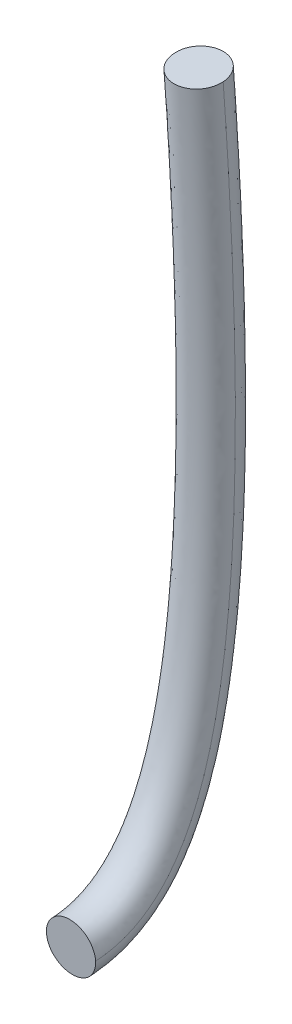
ISO-10303-21;
HEADER;
FILE_DESCRIPTION(('STEP AP214'),'2;1');
FILE_NAME('part.step','',(''),(''),'','','');
FILE_SCHEMA(('AUTOMOTIVE_DESIGN { 1 0 10303 214 1 1 1 1 }'));
ENDSEC;
DATA;
#1=APPLICATION_CONTEXT('core data for automotive mechanical design processes');
#2=APPLICATION_PROTOCOL_DEFINITION('international standard','automotive_design',2000,#1);
#3=PRODUCT_CONTEXT('',#1,'mechanical');
#4=PRODUCT('Part','Part','',(#3));
#5=PRODUCT_RELATED_PRODUCT_CATEGORY('part','',(#4));
#6=PRODUCT_DEFINITION_FORMATION('','',#4);
#7=PRODUCT_DEFINITION_CONTEXT('part definition',#1,'design');
#8=PRODUCT_DEFINITION('design','',#6,#7);
#9=PRODUCT_DEFINITION_SHAPE('','',#8);
#10=(LENGTH_UNIT() NAMED_UNIT(*) SI_UNIT(.MILLI.,.METRE.));
#11=(NAMED_UNIT(*) PLANE_ANGLE_UNIT() SI_UNIT($,.RADIAN.));
#12=(NAMED_UNIT(*) SI_UNIT($,.STERADIAN.) SOLID_ANGLE_UNIT());
#13=UNCERTAINTY_MEASURE_WITH_UNIT(LENGTH_MEASURE(1.E-05),#10,'distance_accuracy_value','');
#14=(GEOMETRIC_REPRESENTATION_CONTEXT(3) GLOBAL_UNCERTAINTY_ASSIGNED_CONTEXT((#13)) GLOBAL_UNIT_ASSIGNED_CONTEXT((#10,
#11,#12)) REPRESENTATION_CONTEXT('',''));
#15=CARTESIAN_POINT('',(0.,0.,0.));
#16=DIRECTION('',(0.,0.,1.));
#17=DIRECTION('',(1.,0.,0.));
#18=AXIS2_PLACEMENT_3D('',#15,#16,#17);
#19=CARTESIAN_POINT('',(9.115,-7.38568943191456,11.1672900449514));
#20=CARTESIAN_POINT('',(9.11499999999981,-7.37642950308164,10.9994364502612));
#21=CARTESIAN_POINT('',(9.1149999999996,-7.27630161286562,10.6948057955698));
#22=CARTESIAN_POINT('',(9.11499999999973,-6.87048720732761,10.3352015018694));
#23=CARTESIAN_POINT('',(9.11500000000011,-6.18721226743467,10.0812548456688));
#24=CARTESIAN_POINT('',(9.11500000000063,-5.0663778437877,9.90824199229226));
#25=CARTESIAN_POINT('',(9.11500000000089,-3.38097481614013,9.86452831959879));
#26=CARTESIAN_POINT('',(9.11500000000045,-1.83527381521949,9.93899557759439));
#27=CARTESIAN_POINT('',(9.115,-1.00000001490137,10.0000001490162));
#28=CARTESIAN_POINT('',(9.11500000000102,-7.43610265920569,11.1645089135862));
#29=CARTESIAN_POINT('',(9.11500000000083,-7.42638032085317,10.9882732782254));
#30=CARTESIAN_POINT('',(9.11500000000062,-7.31962473383052,10.6638759934467));
#31=CARTESIAN_POINT('',(9.11500000000075,-6.89389539217406,10.2892055228043));
#32=CARTESIAN_POINT('',(9.11500000000113,-6.19822133407688,10.0317252218436));
#33=CARTESIAN_POINT('',(9.11500000000165,-5.06946229004234,9.85764906158687));
#34=CARTESIAN_POINT('',(9.11500000000191,-3.37988701446978,9.81403625051808));
#35=CARTESIAN_POINT('',(9.11500000000147,-1.83238214013708,9.88858240859414));
#36=CARTESIAN_POINT('',(9.11500000000102,-0.996322261093758,9.94964439160444));
#37=CARTESIAN_POINT('',(9.09146786962668,-7.50310492328892,11.1608126198119));
#38=CARTESIAN_POINT('',(9.09146786962649,-7.49276846163421,10.9734448466436));
#39=CARTESIAN_POINT('',(9.09146786962628,-7.3771976458285,10.6227772349468));
#40=CARTESIAN_POINT('',(9.09146786962641,-6.92501159557868,10.2280915664686));
#41=CARTESIAN_POINT('',(9.09146786962679,-6.21285951910928,9.96590741199907));
#42=CARTESIAN_POINT('',(9.09146786962731,-5.07356734308345,9.79041474226226));
#43=CARTESIAN_POINT('',(9.09146786962757,-3.37844637103866,9.74693247719632));
#44=CARTESIAN_POINT('',(9.09146786962713,-1.82853816669608,9.82158027751201));
#45=CARTESIAN_POINT('',(9.09146786962668,-0.991434301225067,9.88271850850778));
#46=CARTESIAN_POINT('',(9.01948342635628,-7.57470631373006,11.1568626074155));
#47=CARTESIAN_POINT('',(9.0194834263561,-7.56371410597961,10.9576082051635));
#48=CARTESIAN_POINT('',(9.01948342635589,-7.43871511251737,10.5788679079541));
#49=CARTESIAN_POINT('',(9.01948342635602,-6.95826994744993,10.1628034777738));
#50=CARTESIAN_POINT('',(9.0194834263564,-6.22851016756536,9.89558376968682));
#51=CARTESIAN_POINT('',(9.01948342635692,-5.07796086887615,9.71857342657148));
#52=CARTESIAN_POINT('',(9.01948342635718,-3.37691291395785,9.67522650304673));
#53=CARTESIAN_POINT('',(9.01948342635674,-1.82442943423223,9.7499790951865));
#54=CARTESIAN_POINT('',(9.01948342635629,-0.986210825155924,9.81119874194781));
#55=CARTESIAN_POINT('',(8.92616546454589,-7.61993960906373,11.1543672358006));
#56=CARTESIAN_POINT('',(8.9261654645457,-7.6085323247427,10.9475887914416));
#57=CARTESIAN_POINT('',(8.9261654645455,-7.47758927953358,10.5511125803209));
#58=CARTESIAN_POINT('',(8.92616546454563,-6.9792708308918,10.1215265361115));
#59=CARTESIAN_POINT('',(8.926165464546,-6.23838546687176,9.85113924070783));
#60=CARTESIAN_POINT('',(8.92616546454652,-5.08072612978375,9.67317617231265));
#61=CARTESIAN_POINT('',(8.92616546454679,-3.37593483319648,9.62992115281699));
#62=CARTESIAN_POINT('',(8.92616546454635,-1.82183518214691,9.70474582988298));
#63=CARTESIAN_POINT('',(8.9261654645459,-0.982910958571682,9.76601701149439));
#64=CARTESIAN_POINT('',(8.78495011396524,-7.60399562018094,11.1552468130456));
#65=CARTESIAN_POINT('',(8.78495011396506,-7.59273481891444,10.9511236490569));
#66=CARTESIAN_POINT('',(8.78495011396485,-7.46388435940186,10.5608993423383));
#67=CARTESIAN_POINT('',(8.78495011396498,-6.97187044283369,10.1360828455063));
#68=CARTESIAN_POINT('',(8.78495011396535,-6.23490712162765,9.86680916057501));
#69=CARTESIAN_POINT('',(8.78495011396588,-5.07975363134254,9.68918061397055));
#70=CARTESIAN_POINT('',(8.78495011396614,-3.37628159541769,9.64589182494201));
#71=CARTESIAN_POINT('',(8.7849501139657,-1.82274931490772,9.72068982996092));
#72=CARTESIAN_POINT('',(8.78495011396525,-0.984074106994761,9.78194282460927));
#73=CARTESIAN_POINT('',(8.65809750279449,-7.47839072925796,11.16217602033));
#74=CARTESIAN_POINT('',(8.65809750279431,-7.46828109604625,10.9789199385373));
#75=CARTESIAN_POINT('',(8.6580975027941,-7.35595731599758,10.6379427983767));
#76=CARTESIAN_POINT('',(8.65809750279423,-6.91353780753687,10.2506457786371));
#77=CARTESIAN_POINT('',(8.65809750279461,-6.20746454637962,9.99019160163456));
#78=CARTESIAN_POINT('',(8.65809750279512,-5.07205701612371,9.81521916077235));
#79=CARTESIAN_POINT('',(8.65809750279539,-3.37898125058913,9.77168635012814));
#80=CARTESIAN_POINT('',(8.65809750279494,-1.82995552073657,9.84629446039183));
#81=CARTESIAN_POINT('',(8.65809750279449,-0.99323725505475,9.90740452894569));
#82=CARTESIAN_POINT('',(8.65800612197229,-7.34852671464861,11.1693401894111));
#83=CARTESIAN_POINT('',(8.65800612197211,-7.33960755615136,11.0076636968156));
#84=CARTESIAN_POINT('',(8.6580061219719,-7.24436683729051,10.7176040866006));
#85=CARTESIAN_POINT('',(8.65800612197203,-6.8532303937795,10.3691040594047));
#86=CARTESIAN_POINT('',(8.65800612197241,-6.1790953507803,10.1177639385277));
#87=CARTESIAN_POINT('',(8.65800612197292,-5.06410284199409,9.9455356576175));
#88=CARTESIAN_POINT('',(8.65800612197319,-3.38177555468385,9.90174842050027));
#89=CARTESIAN_POINT('',(8.65800612197274,-1.83740561899919,9.97615823942421));
#90=CARTESIAN_POINT('',(8.65800612197229,-1.00271111538596,10.0371205016688));
#91=CARTESIAN_POINT('',(8.68710455996887,-7.28816548469182,11.1726701192508));
#92=CARTESIAN_POINT('',(8.68710455996868,-7.2797995148274,11.0210212091821));
#93=CARTESIAN_POINT('',(8.68710455996847,-7.19250124903203,10.7546279948865));
#94=CARTESIAN_POINT('',(8.6871045599686,-6.82519755365371,10.4241580697461));
#95=CARTESIAN_POINT('',(8.68710455996898,-6.16590711497942,10.1770566494357));
#96=CARTESIAN_POINT('',(8.68710455996949,-5.06040385024568,10.0061049585468));
#97=CARTESIAN_POINT('',(8.68710455996976,-3.38307266499743,9.9622006231788));
#98=CARTESIAN_POINT('',(8.68710455996931,-1.84086870129545,10.0365193415074));
#99=CARTESIAN_POINT('',(8.68710455996886,-1.00711459747257,10.0974129212599));
#100=B_SPLINE_SURFACE_WITH_KNOTS('',3,3,((#19,#20,#21,#22,#23,#24,#25,#26,#27),(#28,#29,#30,#31,
#32,#33,#34,#35,#36),(#37,#38,#39,#40,#41,#42,#43,#44,#45),(#46,#47,#48,#49,#50,#51,#52,#53,
#54),(#55,#56,#57,#58,#59,#60,#61,#62,#63),(#64,#65,#66,#67,#68,#69,#70,#71,#72),(#73,#74,#75,
#76,#77,#78,#79,#80,#81),(#82,#83,#84,#85,#86,#87,#88,#89,#90),(#91,#92,#93,#94,#95,#96,#97,#98,
#99)),.UNSPECIFIED.,.F.,.F.,.F.,(4,1,1,1,1,1,4),(4,1,1,1,1,1,4),(-3.14159265358979,
-2.46839422782055,-2.24399475256414,-1.79519580205131,-1.12199737628207,-0.448798950512828,
0.448798950512828),(0.,0.142857142857143,0.285714285714286,0.428571428571429,0.571428571428571,
0.785714285714286,1.),.UNSPECIFIED.);
#101=CARTESIAN_POINT('',(9.115,-7.38568943191456,11.1672900449514));
#102=CARTESIAN_POINT('',(9.11499999999981,-7.37642950308164,10.9994364502612));
#103=CARTESIAN_POINT('',(9.1149999999996,-7.27630161286562,10.6948057955698));
#104=CARTESIAN_POINT('',(9.11499999999973,-6.87048720732761,10.3352015018694));
#105=CARTESIAN_POINT('',(9.11500000000011,-6.18721226743467,10.0812548456688));
#106=CARTESIAN_POINT('',(9.11500000000063,-5.0663778437877,9.90824199229226));
#107=CARTESIAN_POINT('',(9.11500000000089,-3.38097481614013,9.86452831959879));
#108=CARTESIAN_POINT('',(9.11500000000045,-1.83527381521949,9.93899557759439));
#109=CARTESIAN_POINT('',(9.115,-1.00000001490137,10.0000001490162));
#110=B_SPLINE_CURVE_WITH_KNOTS('',3,(#101,#102,#103,#104,#105,#106,#107,#108,#109),
.UNSPECIFIED.,.F.,.F.,(4,1,1,1,1,1,4),(0.,0.142857142857143,0.285714285714286,0.428571428571429,
0.571428571428571,0.785714285714286,1.),.UNSPECIFIED.);
#111=CARTESIAN_POINT('',(9.115,-7.38568943191456,11.1672900449514));
#112=VERTEX_POINT('',#111);
#113=CARTESIAN_POINT('',(9.115,-1.00000001490137,10.0000001490162));
#114=VERTEX_POINT('',#113);
#115=EDGE_CURVE('E11',#112,#114,#110,.T.);
#116=CARTESIAN_POINT('',(9.115,-7.38568943191456,11.1672900449514));
#117=CARTESIAN_POINT('',(9.11502150375269,-7.41102688804313,11.1658922611209));
#118=CARTESIAN_POINT('',(9.1105266851147,-7.43643690572857,11.1644904743087));
#119=CARTESIAN_POINT('',(9.09358015021283,-7.48438536470254,11.1618453160768));
#120=CARTESIAN_POINT('',(9.0811335997199,-7.50692565888837,11.1606018424389));
#121=CARTESIAN_POINT('',(9.04931664792516,-7.54640566402071,11.1584238608561));
#122=CARTESIAN_POINT('',(9.02995935080572,-7.56335585870002,11.1574887745583));
#123=CARTESIAN_POINT('',(8.98691861324188,-7.58995933594375,11.1560211485213));
#124=CARTESIAN_POINT('',(8.96326353894417,-7.59965844790595,11.1554860805254));
#125=CARTESIAN_POINT('',(8.91399795485899,-7.61052252338936,11.154886745337));
#126=CARTESIAN_POINT('',(8.88838235751675,-7.61166446642498,11.1548237481086));
#127=CARTESIAN_POINT('',(8.83811274712331,-7.60564072225471,11.1551560581936));
#128=CARTESIAN_POINT('',(8.81346024734172,-7.59846246495662,11.1555520589576));
#129=CARTESIAN_POINT('',(8.76799844305958,-7.57620580676407,11.1567798853339));
#130=CARTESIAN_POINT('',(8.74719491631755,-7.56111565729772,11.1576123590763));
#131=CARTESIAN_POINT('',(8.7114956462023,-7.52495376548272,11.1596072912986));
#132=CARTESIAN_POINT('',(8.69662328179504,-7.50385890300791,11.1607710252396));
#133=CARTESIAN_POINT('',(8.67544488125567,-7.45822820804922,11.1632883200803));
#134=CARTESIAN_POINT('',(8.66897015663039,-7.43377141758026,11.164637520493));
#135=CARTESIAN_POINT('',(8.66520728551536,-7.39652503640051,11.1666922804143));
#136=CARTESIAN_POINT('',(8.66496295390503,-7.3839316170392,11.1673870177971));
#137=CARTESIAN_POINT('',(8.66649800867051,-7.35885683320153,11.1687703108642));
#138=CARTESIAN_POINT('',(8.66827637490492,-7.34637541543619,11.1694588694884));
#139=CARTESIAN_POINT('',(8.67399466494185,-7.32135627791583,11.1708390927319));
#140=CARTESIAN_POINT('',(8.67802234400967,-7.30883826343758,11.1715296702762));
#141=CARTESIAN_POINT('',(8.68833435761887,-7.28476946990109,11.1728574661786));
#142=CARTESIAN_POINT('',(8.69461726406506,-7.2732180844322,11.1734947179905));
#143=CARTESIAN_POINT('',(8.70861250152426,-7.25220882786075,11.1746537293363));
#144=CARTESIAN_POINT('',(8.71618998096918,-7.24266022454367,11.175180494267));
#145=CARTESIAN_POINT('',(8.73275493114849,-7.22485214097947,11.1761629074632));
#146=CARTESIAN_POINT('',(8.74174429570084,-7.21659442236833,11.176618458545));
#147=CARTESIAN_POINT('',(8.76149462788101,-7.20109585572303,11.1774734633151));
#148=CARTESIAN_POINT('',(8.7723312103918,-7.19395083271736,11.1778676306529));
#149=CARTESIAN_POINT('',(8.79503818247738,-7.18157814364919,11.1785501910738));
#150=CARTESIAN_POINT('',(8.80690707103443,-7.1763477494616,11.1788387346586));
#151=CARTESIAN_POINT('',(8.83134120303611,-7.16811791780666,11.1792927473091));
#152=CARTESIAN_POINT('',(8.8439028104246,-7.16510783820072,11.1794588034665));
#153=CARTESIAN_POINT('',(8.86936600367048,-7.16140061577664,11.1796633186923));
#154=CARTESIAN_POINT('',(8.8822677987992,-7.16070493180794,11.1797016972807));
#155=CARTESIAN_POINT('',(8.9072848551559,-7.16145704245299,11.1796602058187));
#156=CARTESIAN_POINT('',(8.91940418295058,-7.16278851443465,11.1795867529039));
#157=CARTESIAN_POINT('',(8.94329591571785,-7.16730850555005,11.1793373999119));
#158=CARTESIAN_POINT('',(8.95506813933346,-7.17049797801143,11.1791614472427));
#159=CARTESIAN_POINT('',(8.97888058979552,-7.17899383745214,11.1786927587172));
#160=CARTESIAN_POINT('',(8.99086891332001,-7.18444715417577,11.1783919172318));
#161=CARTESIAN_POINT('',(9.01367808052342,-7.19737163089593,11.1776789165072));
#162=CARTESIAN_POINT('',(9.02450056216093,-7.20483990682577,11.1772669163725));
#163=CARTESIAN_POINT('',(9.05355204176053,-7.22920343405784,11.1759228609847));
#164=CARTESIAN_POINT('',(9.06976499635089,-7.24856150843901,11.1748549399107));
#165=CARTESIAN_POINT('',(9.09535867680018,-7.29145279174296,11.1724887693698));
#166=CARTESIAN_POINT('',(9.10469679800663,-7.31501093058416,11.1711891446015));
#167=CARTESIAN_POINT('',(9.11327115504602,-7.35460417545835,11.1690049159559));
#168=CARTESIAN_POINT('',(9.11498679745432,-7.37013312754952,11.168148234921));
#169=CARTESIAN_POINT('',(9.115,-7.38568943191456,11.1672900449514));
#170=B_SPLINE_CURVE_WITH_KNOTS('',3,(#116,#117,#118,#119,#120,#121,#122,#123,#124,#125,#126,
#127,#128,#129,#130,#131,#132,#133,#134,#135,#136,#137,#138,#139,#140,#141,#142,#143,#144,#145,
#146,#147,#148,#149,#150,#151,#152,#153,#154,#155,#156,#157,#158,#159,#160,#161,#162,#163,#164,
#165,#166,#167,#168,#169),.UNSPECIFIED.,.T.,.F.,(4,2,2,2,2,2,2,2,2,2,2,2,2,2,2,2,2,2,2,2,2,2,2,
2,2,2,4),(0.,0.0759550975268622,0.15186090161518,0.227623530724837,0.302903168263828,
0.378385250535896,0.453981519338895,0.529690362242365,0.605694746384783,0.680147450510329,
0.717871643937056,0.755576819716802,0.794867615848856,0.834133575330364,0.870583119310508,
0.907081978767215,0.945862264597012,0.98458707590115,1.02312504817336,1.06168730776142,
1.09811864686712,1.13456869513427,1.17388923976056,1.21315379967089,1.28748057511203,
1.36226417726598,1.40889792807381),.UNSPECIFIED.);
#171=CARTESIAN_POINT('',(8.68710455996887,-7.28816548469182,11.1726701192508));
#172=VERTEX_POINT('',#171);
#173=EDGE_CURVE('E47',#112,#172,#170,.T.);
#174=CARTESIAN_POINT('',(8.68710455996887,-7.28816548469182,11.1726701192508));
#175=CARTESIAN_POINT('',(8.68710455996868,-7.2797995148274,11.0210212091821));
#176=CARTESIAN_POINT('',(8.68710455996847,-7.19250124903203,10.7546279948865));
#177=CARTESIAN_POINT('',(8.6871045599686,-6.82519755365371,10.4241580697461));
#178=CARTESIAN_POINT('',(8.68710455996898,-6.16590711497942,10.1770566494357));
#179=CARTESIAN_POINT('',(8.68710455996949,-5.06040385024568,10.0061049585468));
#180=CARTESIAN_POINT('',(8.68710455996976,-3.38307266499743,9.9622006231788));
#181=CARTESIAN_POINT('',(8.68710455996931,-1.84086870129545,10.0365193415074));
#182=CARTESIAN_POINT('',(8.68710455996886,-1.00711459747257,10.0974129212599));
#183=B_SPLINE_CURVE_WITH_KNOTS('',3,(#174,#175,#176,#177,#178,#179,#180,#181,#182),
.UNSPECIFIED.,.F.,.F.,(4,1,1,1,1,1,4),(0.,0.142857142857143,0.285714285714286,0.428571428571429,
0.571428571428571,0.785714285714286,1.),.UNSPECIFIED.);
#184=CARTESIAN_POINT('',(8.68710455996886,-1.00711459747257,10.0974129212599));
#185=VERTEX_POINT('',#184);
#186=EDGE_CURVE('E29',#172,#185,#183,.T.);
#187=CARTESIAN_POINT('',(9.115,-1.00000001490137,10.0000001490162));
#188=CARTESIAN_POINT('',(9.11498901430011,-1.00092585192697,10.0126766975572));
#189=CARTESIAN_POINT('',(9.11384701593787,-1.00185197030158,10.025357098325));
#190=CARTESIAN_POINT('',(9.10941629237594,-1.0036781034014,10.0503604890319));
#191=CARTESIAN_POINT('',(9.10612246797018,-1.00457805080439,10.0626825571961));
#192=CARTESIAN_POINT('',(9.09757840086165,-1.00632415630139,10.0865902110036));
#193=CARTESIAN_POINT('',(9.09233384739816,-1.00717046251892,10.0981778247525));
#194=CARTESIAN_POINT('',(9.08003173485117,-1.00878924001675,10.1203421052476));
#195=CARTESIAN_POINT('',(9.07297546454952,-1.00956176324951,10.1309194833263));
#196=CARTESIAN_POINT('',(9.05695045516042,-1.01103236253846,10.1510549097081));
#197=CARTESIAN_POINT('',(9.04793101554166,-1.01172753603882,10.1605732162546));
#198=CARTESIAN_POINT('',(9.02828423252356,-1.01298399163123,10.1777765899221));
#199=CARTESIAN_POINT('',(9.01765796860117,-1.01354536296519,10.1854628789423));
#200=CARTESIAN_POINT('',(8.99599893098709,-1.01448705632819,10.198356532249));
#201=CARTESIAN_POINT('',(8.98504618762839,-1.01487727428849,10.2036993914978));
#202=CARTESIAN_POINT('',(8.9624252608392,-1.01552854345873,10.2126165605258));
#203=CARTESIAN_POINT('',(8.950756118778,-1.01578941716118,10.2161884398746));
#204=CARTESIAN_POINT('',(8.92627108224793,-1.01618840973952,10.2216514410798));
#205=CARTESIAN_POINT('',(8.91342880747215,-1.01631798749099,10.2234256179715));
#206=CARTESIAN_POINT('',(8.88763996725236,-1.01641892256849,10.2248076197427));
#207=CARTESIAN_POINT('',(8.87469357453767,-1.01639050289369,10.224418497924));
#208=CARTESIAN_POINT('',(8.84911603647785,-1.0161655295476,10.2213381657884));
#209=CARTESIAN_POINT('',(8.83648395928481,-1.01596955503972,10.2186548853693));
#210=CARTESIAN_POINT('',(8.81191186638732,-1.01541456809251,10.2110560112894));
#211=CARTESIAN_POINT('',(8.79997226798002,-1.0150554584736,10.206139087047));
#212=CARTESIAN_POINT('',(8.77772707782314,-1.01422088371572,10.1947121002914));
#213=CARTESIAN_POINT('',(8.76736765832698,-1.01375294106946,10.1883050356506));
#214=CARTESIAN_POINT('',(8.74776098037133,-1.01270585206926,10.1739683066467));
#215=CARTESIAN_POINT('',(8.73851435851497,-1.01212664254963,10.1660377774195));
#216=CARTESIAN_POINT('',(8.72067979865496,-1.01081978435744,10.1481442920096));
#217=CARTESIAN_POINT('',(8.71220355170131,-1.01008397224733,10.1380695621457));
#218=CARTESIAN_POINT('',(8.6971735549177,-1.00851669852357,10.1166104706566));
#219=CARTESIAN_POINT('',(8.69061698773634,-1.00768537959942,10.1052280627343));
#220=CARTESIAN_POINT('',(8.67487136368353,-1.00516503535857,10.0707195420922));
#221=CARTESIAN_POINT('',(8.66857601428728,-1.00337411855095,10.046198332401));
#222=CARTESIAN_POINT('',(8.66512603200107,-1.00065795012305,10.0090085895308));
#223=CARTESIAN_POINT('',(8.66498708565985,-0.999743694847211,9.99649061815727));
#224=CARTESIAN_POINT('',(8.66670794071404,-0.997924271168115,9.97157909275174));
#225=CARTESIAN_POINT('',(8.66856643345768,-0.997019097207049,9.95918546262227));
#226=CARTESIAN_POINT('',(8.67443408769315,-0.995200172463922,9.93428076864159));
#227=CARTESIAN_POINT('',(8.67854221335211,-0.994288096072632,9.92179263052709));
#228=CARTESIAN_POINT('',(8.68899507582735,-0.992534440591517,9.89778160243497));
#229=CARTESIAN_POINT('',(8.6953395059197,-0.991692851853425,9.88625858035343));
#230=CARTESIAN_POINT('',(8.70948995197738,-0.990157431548207,9.86523562545794));
#231=CARTESIAN_POINT('',(8.71717335089121,-0.98945753803004,9.855652692489));
#232=CARTESIAN_POINT('',(8.73397558287366,-0.988155788052031,9.83782914868159));
#233=CARTESIAN_POINT('',(8.74309496794938,-0.98755396947494,9.82958905653325));
#234=CARTESIAN_POINT('',(8.7629628524378,-0.986440157243322,9.8143387539108));
#235=CARTESIAN_POINT('',(8.77376491695086,-0.985933202077632,9.80739753036045));
#236=CARTESIAN_POINT('',(8.7964137732602,-0.985064224309434,9.7954994980342));
#237=CARTESIAN_POINT('',(8.80826018380854,-0.984702149082371,9.79054196872359));
#238=CARTESIAN_POINT('',(8.83237247395605,-0.98413579727984,9.78278748719243));
#239=CARTESIAN_POINT('',(8.84462493869779,-0.983928463763709,9.77994867938));
#240=CARTESIAN_POINT('',(8.86943212571939,-0.983661545063639,9.77629403200233));
#241=CARTESIAN_POINT('',(8.88198694603522,-0.983602008470851,9.7754788577465));
#242=CARTESIAN_POINT('',(8.90738881627922,-0.983634285205522,9.77592079037898));
#243=CARTESIAN_POINT('',(8.9202350890041,-0.983730025436484,9.7772316643791));
#244=CARTESIAN_POINT('',(8.94549259137818,-0.984084925403839,9.78209095012717));
#245=CARTESIAN_POINT('',(8.95790394246261,-0.984344039134427,9.78563873196423));
#246=CARTESIAN_POINT('',(8.98156898846338,-0.98500259834339,9.79465571610814));
#247=CARTESIAN_POINT('',(8.99284629466593,-0.985397581030034,9.8000638139285));
#248=CARTESIAN_POINT('',(9.01437210359962,-0.986315698691671,9.81263466903839));
#249=CARTESIAN_POINT('',(9.02462041213203,-0.98683885779305,9.81979775666609));
#250=CARTESIAN_POINT('',(9.04404574561764,-0.988016663840398,9.83592426178344));
#251=CARTESIAN_POINT('',(9.05318826285584,-0.988674357999822,9.84492940168017));
#252=CARTESIAN_POINT('',(9.06974994183654,-0.990094782320399,9.86437783304637));
#253=CARTESIAN_POINT('',(9.07716920386815,-0.990857506364961,9.87482104076754));
#254=CARTESIAN_POINT('',(9.09625850287522,-0.993226919889535,9.90726302000088));
#255=CARTESIAN_POINT('',(9.10533681421724,-0.994951056345921,9.93086987398956));
#256=CARTESIAN_POINT('',(9.11343753999394,-0.997805967460436,9.96995927992463));
#257=CARTESIAN_POINT('',(9.1150130192934,-0.998902793604644,9.98497700925891));
#258=CARTESIAN_POINT('',(9.115,-1.00000001490137,10.0000001490162));
#259=B_SPLINE_CURVE_WITH_KNOTS('',3,(#187,#188,#189,#190,#191,#192,#193,#194,#195,#196,#197,
#198,#199,#200,#201,#202,#203,#204,#205,#206,#207,#208,#209,#210,#211,#212,#213,#214,#215,#216,
#217,#218,#219,#220,#221,#222,#223,#224,#225,#226,#227,#228,#229,#230,#231,#232,#233,#234,#235,
#236,#237,#238,#239,#240,#241,#242,#243,#244,#245,#246,#247,#248,#249,#250,#251,#252,#253,#254,
#255,#256,#257,#258),.UNSPECIFIED.,.T.,.F.,(4,2,2,2,2,2,2,2,2,2,2,2,2,2,2,2,2,2,2,2,2,2,2,2,2,2,
2,2,2,2,2,2,2,2,2,4),(0.,0.0380935723126585,0.0762777444387157,0.114351415858416,
0.152398077891623,0.191577898355752,0.230731513503811,0.267154602670745,0.303627540192716,
0.342344744119651,0.381007316075333,0.419536786310792,0.458089238711881,0.49451224982939,
0.530955999558764,0.570312145360892,0.609610238581211,0.684070676623457,0.72161737646754,
0.75913949202303,0.798462936133554,0.837780988871418,0.874529473868309,0.911292119983357,
0.949651953340675,0.98799784062901,1.0255645465112,1.06314360155363,1.10168792411902,
1.14022139748834,1.17759401338424,1.21497366926343,1.25331881602392,1.29166173063389,
1.36617238281176,1.41131756242104),.UNSPECIFIED.);
#260=EDGE_CURVE('E48',#185,#114,#259,.T.);
#261=ORIENTED_EDGE('',*,*,#115,.F.);
#262=ORIENTED_EDGE('',*,*,#173,.T.);
#263=ORIENTED_EDGE('',*,*,#186,.T.);
#264=ORIENTED_EDGE('',*,*,#260,.T.);
#265=EDGE_LOOP('',(#261,#262,#263,#264));
#266=FACE_BOUND('',#265,.T.);
#267=ADVANCED_FACE('F17',(#266),#100,.T.);
#268=CARTESIAN_POINT('',(8.89,-7.38568943191911,11.1672900449514));
#269=DIRECTION('',(-1.11249196396045E-12,0.0550829445172842,-0.998481782118886));
#270=DIRECTION('',(0.,0.998481782118886,0.0550829445172842));
#271=AXIS2_PLACEMENT_3D('',#268,#269,#270);
#272=PLANE('',#271);
#273=ORIENTED_EDGE('',*,*,#173,.F.);
#274=EDGE_CURVE('E50',#172,#112,#170,.T.);
#275=ORIENTED_EDGE('',*,*,#274,.F.);
#276=EDGE_LOOP('',(#273,#275));
#277=FACE_BOUND('',#276,.T.);
#278=ADVANCED_FACE('F54',(#277),#272,.F.);
#279=CARTESIAN_POINT('',(8.89,-1.00000001490116,10.0000001490116));
#280=DIRECTION('',(-5.32623886368089E-13,0.997343536648528,0.0728414024124084));
#281=DIRECTION('',(0.,-0.0728414024124084,0.997343536648528));
#282=AXIS2_PLACEMENT_3D('',#279,#280,#281);
#283=PLANE('',#282);
#284=EDGE_CURVE('E56',#114,#185,#259,.T.);
#285=ORIENTED_EDGE('',*,*,#284,.F.);
#286=ORIENTED_EDGE('',*,*,#260,.F.);
#287=EDGE_LOOP('',(#285,#286));
#288=FACE_BOUND('',#287,.T.);
#289=ADVANCED_FACE('F84',(#288),#283,.T.);
#290=CARTESIAN_POINT('',(8.68710455996887,-7.28816548469182,11.1726701192508));
#291=CARTESIAN_POINT('',(8.68710455996868,-7.2797995148274,11.0210212091821));
#292=CARTESIAN_POINT('',(8.68710455996847,-7.19250124903203,10.7546279948865));
#293=CARTESIAN_POINT('',(8.6871045599686,-6.82519755365371,10.4241580697461));
#294=CARTESIAN_POINT('',(8.68710455996898,-6.16590711497942,10.1770566494357));
#295=CARTESIAN_POINT('',(8.68710455996949,-5.06040385024568,10.0061049585468));
#296=CARTESIAN_POINT('',(8.68710455996976,-3.38307266499743,9.9622006231788));
#297=CARTESIAN_POINT('',(8.68710455996931,-1.84086870129545,10.0365193415074));
#298=CARTESIAN_POINT('',(8.68710455996886,-1.00711459747257,10.0974129212599));
#299=CARTESIAN_POINT('',(8.71620299796544,-7.22780425473503,11.1760000490905));
#300=CARTESIAN_POINT('',(8.71620299796525,-7.21999147350344,11.0343787215485));
#301=CARTESIAN_POINT('',(8.71620299796504,-7.14063566077355,10.7916519031723));
#302=CARTESIAN_POINT('',(8.71620299796516,-6.79716471352792,10.4792120800875));
#303=CARTESIAN_POINT('',(8.71620299796554,-6.15271887917855,10.2363493603437));
#304=CARTESIAN_POINT('',(8.71620299796606,-5.05670485849726,10.0666742594761));
#305=CARTESIAN_POINT('',(8.71620299796633,-3.38436977531101,10.0226528258573));
#306=CARTESIAN_POINT('',(8.71620299796588,-1.84433178359171,10.0968804435905));
#307=CARTESIAN_POINT('',(8.71620299796544,-1.01151807955919,10.1577053408509));
#308=CARTESIAN_POINT('',(8.83270118517709,-7.13477535160427,11.1811321466423));
#309=CARTESIAN_POINT('',(8.83270118517691,-7.12781478237319,11.0549587615533));
#310=CARTESIAN_POINT('',(8.83270118517669,-7.06070528340486,10.84870606406));
#311=CARTESIAN_POINT('',(8.83270118517681,-6.75395611160461,10.5640472291473));
#312=CARTESIAN_POINT('',(8.83270118517719,-6.13238787380285,10.3277232475265));
#313=CARTESIAN_POINT('',(8.83270118517771,-5.05099937622319,10.1600183239416));
#314=CARTESIAN_POINT('',(8.83270118517797,-3.38636472617138,10.1158192704319));
#315=CARTESIAN_POINT('',(8.83270118517753,-1.84966971476232,10.1899091044576));
#316=CARTESIAN_POINT('',(8.83270118517708,-1.01830473895571,10.250628193246));
#317=CARTESIAN_POINT('',(9.05061455818429,-7.18477726035448,11.1783737063633));
#318=CARTESIAN_POINT('',(9.0506145581841,-7.17735935019288,11.0439101582972));
#319=CARTESIAN_POINT('',(9.05061455818388,-7.10365706607693,10.8180542323429));
#320=CARTESIAN_POINT('',(9.05061455818401,-6.77718864683143,10.5184772738552));
#321=CARTESIAN_POINT('',(9.05061455818439,-6.14332583996041,10.278626970331));
#322=CARTESIAN_POINT('',(9.05061455818491,-5.05407498371133,10.1098578264355));
#323=CARTESIAN_POINT('',(9.05061455818517,-3.38530060964265,10.0657486557296));
#324=CARTESIAN_POINT('',(9.05061455818473,-1.84679942984556,10.139907414408));
#325=CARTESIAN_POINT('',(9.05061455818428,-1.01465699172386,10.2006832854818));
#326=CARTESIAN_POINT('',(9.11499999999864,-7.31847179552639,11.1709982201049));
#327=CARTESIAN_POINT('',(9.11499999999845,-7.30982729388697,11.0143003987002));
#328=CARTESIAN_POINT('',(9.11499999999824,-7.21855287871943,10.7360234144216));
#329=CARTESIAN_POINT('',(9.11499999999837,-6.83926305248654,10.3964856595219));
#330=CARTESIAN_POINT('',(9.11499999999874,-6.17251734712793,10.1472691000248));
#331=CARTESIAN_POINT('',(9.11499999999926,-5.0622511517048,9.97568226837962));
#332=CARTESIAN_POINT('',(9.11499999999953,-3.382412431283,9.93184288230997));
#333=CARTESIAN_POINT('',(9.11499999999909,-1.83913128396928,10.00621299735));
#334=CARTESIAN_POINT('',(9.11499999999864,-1.00490368664486,10.0671411588984));
#335=CARTESIAN_POINT('',(9.115,-7.38568943191456,11.1672900449514));
#336=CARTESIAN_POINT('',(9.11499999999981,-7.37642950308164,10.9994364502612));
#337=CARTESIAN_POINT('',(9.1149999999996,-7.27630161286562,10.6948057955698));
#338=CARTESIAN_POINT('',(9.11499999999973,-6.87048720732761,10.3352015018694));
#339=CARTESIAN_POINT('',(9.11500000000011,-6.18721226743467,10.0812548456688));
#340=CARTESIAN_POINT('',(9.11500000000063,-5.0663778437877,9.90824199229226));
#341=CARTESIAN_POINT('',(9.11500000000089,-3.38097481614013,9.86452831959879));
#342=CARTESIAN_POINT('',(9.11500000000045,-1.83527381521949,9.93899557759439));
#343=CARTESIAN_POINT('',(9.115,-1.00000001490137,10.0000001490162));
#344=B_SPLINE_SURFACE_WITH_KNOTS('',3,3,((#290,#291,#292,#293,#294,#295,#296,#297,#298),(#299,
#300,#301,#302,#303,#304,#305,#306,#307),(#308,#309,#310,#311,#312,#313,#314,#315,#316),(#317,
#318,#319,#320,#321,#322,#323,#324,#325),(#326,#327,#328,#329,#330,#331,#332,#333,#334),(#335,
#336,#337,#338,#339,#340,#341,#342,#343)),.UNSPECIFIED.,.F.,.F.,.F.,(4,1,1,4),(4,1,1,1,1,1,4),
(0.448798950512828,1.34639685153848,2.24399475256414,3.14159265358979),(0.,0.142857142857143,
0.285714285714286,0.428571428571429,0.571428571428571,0.785714285714286,1.),.UNSPECIFIED.);
#345=ORIENTED_EDGE('',*,*,#274,.T.);
#346=ORIENTED_EDGE('',*,*,#115,.T.);
#347=ORIENTED_EDGE('',*,*,#284,.T.);
#348=ORIENTED_EDGE('',*,*,#186,.F.);
#349=EDGE_LOOP('',(#345,#346,#347,#348));
#350=FACE_BOUND('',#349,.T.);
#351=ADVANCED_FACE('F51',(#350),#344,.T.);
#352=CLOSED_SHELL('',(#267,#278,#289,#351));
#353=MANIFOLD_SOLID_BREP('B1',#352);
#354=ADVANCED_BREP_SHAPE_REPRESENTATION('',(#18,#353),#14);
#355=SHAPE_DEFINITION_REPRESENTATION(#9,#354);
ENDSEC;
END-ISO-10303-21;
